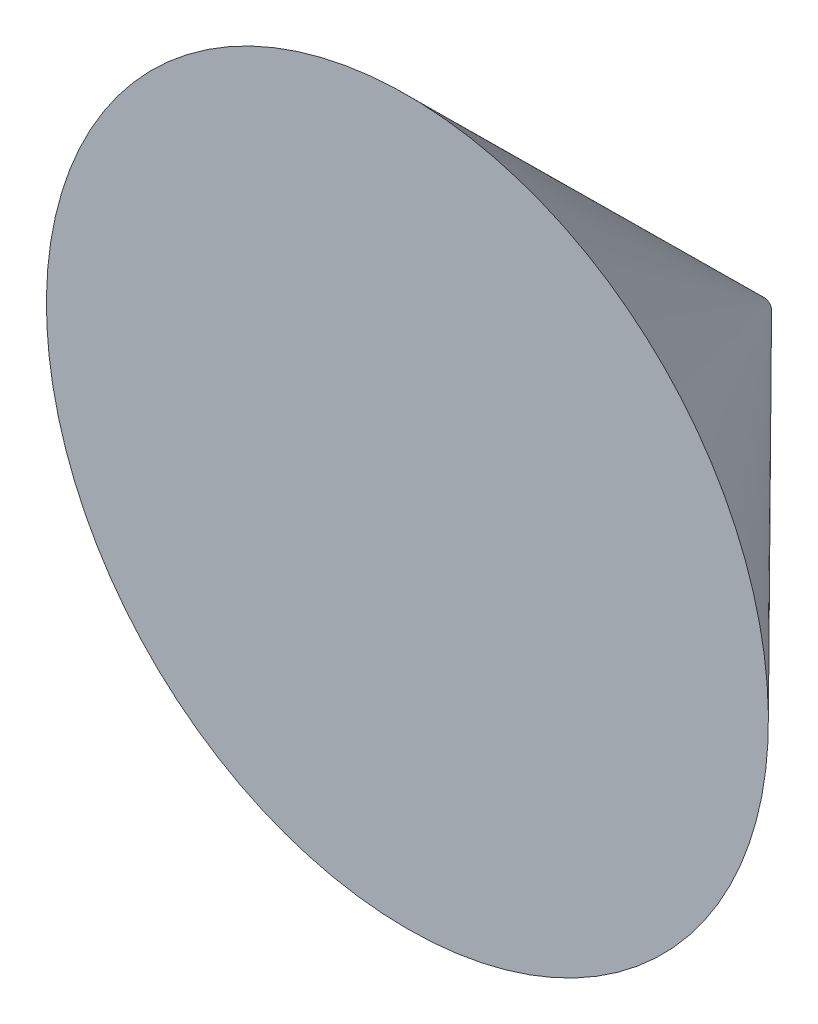
ISO-10303-21;
HEADER;
FILE_DESCRIPTION(('STEP AP214'),'2;1');
FILE_NAME('part.step','',(''),(''),'','','');
FILE_SCHEMA(('AUTOMOTIVE_DESIGN { 1 0 10303 214 1 1 1 1 }'));
ENDSEC;
DATA;
#1=APPLICATION_CONTEXT('core data for automotive mechanical design processes');
#2=APPLICATION_PROTOCOL_DEFINITION('international standard','automotive_design',2000,#1);
#3=PRODUCT_CONTEXT('',#1,'mechanical');
#4=PRODUCT('Part','Part','',(#3));
#5=PRODUCT_RELATED_PRODUCT_CATEGORY('part','',(#4));
#6=PRODUCT_DEFINITION_FORMATION('','',#4);
#7=PRODUCT_DEFINITION_CONTEXT('part definition',#1,'design');
#8=PRODUCT_DEFINITION('design','',#6,#7);
#9=PRODUCT_DEFINITION_SHAPE('','',#8);
#10=(LENGTH_UNIT() NAMED_UNIT(*) SI_UNIT(.MILLI.,.METRE.));
#11=(NAMED_UNIT(*) PLANE_ANGLE_UNIT() SI_UNIT($,.RADIAN.));
#12=(NAMED_UNIT(*) SI_UNIT($,.STERADIAN.) SOLID_ANGLE_UNIT());
#13=UNCERTAINTY_MEASURE_WITH_UNIT(LENGTH_MEASURE(1.E-05),#10,'distance_accuracy_value','');
#14=(GEOMETRIC_REPRESENTATION_CONTEXT(3) GLOBAL_UNCERTAINTY_ASSIGNED_CONTEXT((#13)) GLOBAL_UNIT_ASSIGNED_CONTEXT((#10,
#11,#12)) REPRESENTATION_CONTEXT('',''));
#15=CARTESIAN_POINT('',(0.,0.,0.));
#16=DIRECTION('',(0.,0.,1.));
#17=DIRECTION('',(1.,0.,0.));
#18=AXIS2_PLACEMENT_3D('',#15,#16,#17);
#19=CARTESIAN_POINT('',(0.,4.,0.));
#20=DIRECTION('',(0.,0.,-1.));
#21=DIRECTION('',(0.,1.,0.));
#22=AXIS2_PLACEMENT_3D('',#19,#20,#21);
#23=PLANE('',#22);
#24=CARTESIAN_POINT('',(0.,0.,0.));
#25=DIRECTION('',(0.,0.,-1.));
#26=DIRECTION('',(0.,1.,0.));
#27=AXIS2_PLACEMENT_3D('',#24,#25,#26);
#28=CIRCLE('',#27,4.);
#29=CARTESIAN_POINT('',(0.,-4.,0.));
#30=VERTEX_POINT('',#29);
#31=EDGE_CURVE('E44',#30,#30,#28,.T.);
#32=ORIENTED_EDGE('',*,*,#31,.T.);
#33=EDGE_LOOP('',(#32));
#34=FACE_BOUND('',#33,.T.);
#35=ADVANCED_FACE('F37',(#34),#23,.T.);
#36=CARTESIAN_POINT('',(0.,0.,196.));
#37=DIRECTION('',(0.,0.,1.));
#38=DIRECTION('',(0.,-1.,0.));
#39=AXIS2_PLACEMENT_3D('',#36,#37,#38);
#40=PLANE('',#39);
#41=CARTESIAN_POINT('',(0.,0.,196.));
#42=DIRECTION('',(0.,0.,-1.));
#43=DIRECTION('',(0.,1.,0.));
#44=AXIS2_PLACEMENT_3D('',#41,#42,#43);
#45=CIRCLE('',#44,198.296997276613);
#46=CARTESIAN_POINT('',(0.,-198.296997276614,196.));
#47=VERTEX_POINT('',#46);
#48=EDGE_CURVE('E10',#47,#47,#45,.T.);
#49=ORIENTED_EDGE('',*,*,#48,.F.);
#50=EDGE_LOOP('',(#49));
#51=FACE_BOUND('',#50,.T.);
#52=ADVANCED_FACE('F54',(#51),#40,.T.);
#53=CARTESIAN_POINT('',(0.,0.,0.));
#54=DIRECTION('',(0.,0.,1.));
#55=DIRECTION('',(0.,-1.,0.));
#56=AXIS2_PLACEMENT_3D('',#53,#54,#55);
#57=CONICAL_SURFACE('',#56,4.,0.781034840267457);
#58=CARTESIAN_POINT('',(0.,-198.296997276614,196.));
#59=CARTESIAN_POINT('',(0.,-196.273070221649,193.958333333333));
#60=CARTESIAN_POINT('',(0.,-194.249143166684,191.916666666667));
#61=CARTESIAN_POINT('',(0.,-190.201289056755,187.833333333333));
#62=CARTESIAN_POINT('',(0.,-188.17736200179,185.791666666667));
#63=CARTESIAN_POINT('',(0.,-184.12950789186,181.708333333333));
#64=CARTESIAN_POINT('',(0.,-182.105580836896,179.666666666667));
#65=CARTESIAN_POINT('',(0.,-178.057726726966,175.583333333333));
#66=CARTESIAN_POINT('',(0.,-176.033799672002,173.541666666667));
#67=CARTESIAN_POINT('',(0.,-171.985945562072,169.458333333333));
#68=CARTESIAN_POINT('',(0.,-169.962018507107,167.416666666667));
#69=CARTESIAN_POINT('',(0.,-165.914164397178,163.333333333333));
#70=CARTESIAN_POINT('',(0.,-163.890237342213,161.291666666667));
#71=CARTESIAN_POINT('',(0.,-159.842383232284,157.208333333333));
#72=CARTESIAN_POINT('',(0.,-157.818456177319,155.166666666667));
#73=CARTESIAN_POINT('',(0.,-153.77060206739,151.083333333333));
#74=CARTESIAN_POINT('',(0.,-151.746675012425,149.041666666667));
#75=CARTESIAN_POINT('',(0.,-147.698820902495,144.958333333333));
#76=CARTESIAN_POINT('',(0.,-145.674893847531,142.916666666667));
#77=CARTESIAN_POINT('',(0.,-141.627039737601,138.833333333333));
#78=CARTESIAN_POINT('',(0.,-139.603112682637,136.791666666667));
#79=CARTESIAN_POINT('',(0.,-135.555258572707,132.708333333333));
#80=CARTESIAN_POINT('',(0.,-133.531331517742,130.666666666667));
#81=CARTESIAN_POINT('',(0.,-129.483477407813,126.583333333333));
#82=CARTESIAN_POINT('',(0.,-127.459550352848,124.541666666667));
#83=CARTESIAN_POINT('',(0.,-123.411696242919,120.458333333333));
#84=CARTESIAN_POINT('',(0.,-121.387769187954,118.416666666667));
#85=CARTESIAN_POINT('',(0.,-117.339915078025,114.333333333333));
#86=CARTESIAN_POINT('',(0.,-115.31598802306,112.291666666667));
#87=CARTESIAN_POINT('',(0.,-111.26813391313,108.208333333333));
#88=CARTESIAN_POINT('',(0.,-109.244206858166,106.166666666667));
#89=CARTESIAN_POINT('',(0.,-105.196352748236,102.083333333333));
#90=CARTESIAN_POINT('',(0.,-103.172425693271,100.041666666667));
#91=CARTESIAN_POINT('',(0.,-99.124571583342,95.9583333333333));
#92=CARTESIAN_POINT('',(0.,-97.1006445283773,93.9166666666666));
#93=CARTESIAN_POINT('',(0.,-93.0527904184479,89.8333333333333));
#94=CARTESIAN_POINT('',(0.,-91.0288633634832,87.7916666666667));
#95=CARTESIAN_POINT('',(0.,-86.9810092535537,83.7083333333333));
#96=CARTESIAN_POINT('',(0.,-84.957082198589,81.6666666666667));
#97=CARTESIAN_POINT('',(0.,-80.9092280886595,77.5833333333333));
#98=CARTESIAN_POINT('',(0.,-78.8853010336948,75.5416666666667));
#99=CARTESIAN_POINT('',(0.,-74.8374469237653,71.4583333333333));
#100=CARTESIAN_POINT('',(0.,-72.8135198688006,69.4166666666667));
#101=CARTESIAN_POINT('',(0.,-68.7656657588712,65.3333333333333));
#102=CARTESIAN_POINT('',(0.,-66.7417387039064,63.2916666666667));
#103=CARTESIAN_POINT('',(0.,-62.693884593977,59.2083333333333));
#104=CARTESIAN_POINT('',(0.,-60.6699575390123,57.1666666666667));
#105=CARTESIAN_POINT('',(0.,-56.6221034290828,53.0833333333333));
#106=CARTESIAN_POINT('',(0.,-54.5981763741181,51.0416666666667));
#107=CARTESIAN_POINT('',(0.,-50.5503222641886,46.9583333333333));
#108=CARTESIAN_POINT('',(0.,-48.5263952092239,44.9166666666667));
#109=CARTESIAN_POINT('',(0.,-44.4785410992945,40.8333333333333));
#110=CARTESIAN_POINT('',(0.,-42.4546140443298,38.7916666666667));
#111=CARTESIAN_POINT('',(0.,-38.4067599344003,34.7083333333333));
#112=CARTESIAN_POINT('',(0.,-36.3828328794356,32.6666666666667));
#113=CARTESIAN_POINT('',(0.,-32.3349787695061,28.5833333333333));
#114=CARTESIAN_POINT('',(0.,-30.3110517145414,26.5416666666667));
#115=CARTESIAN_POINT('',(0.,-26.263197604612,22.4583333333333));
#116=CARTESIAN_POINT('',(0.,-24.2392705496472,20.4166666666667));
#117=CARTESIAN_POINT('',(0.,-20.1914164397178,16.3333333333333));
#118=CARTESIAN_POINT('',(0.,-18.1674893847531,14.2916666666667));
#119=CARTESIAN_POINT('',(0.,-14.1196352748236,10.2083333333333));
#120=CARTESIAN_POINT('',(0.,-12.0957082198589,8.16666666666666));
#121=CARTESIAN_POINT('',(0.,-8.04785410992944,4.08333333333333));
#122=CARTESIAN_POINT('',(0.,-6.02392705496472,2.04166666666666));
#123=CARTESIAN_POINT('',(0.,-4.,0.));
#124=B_SPLINE_CURVE_WITH_KNOTS('',3,(#58,#59,#60,#61,#62,#63,#64,#65,#66,#67,#68,#69,#70,#71,
#72,#73,#74,#75,#76,#77,#78,#79,#80,#81,#82,#83,#84,#85,#86,#87,#88,#89,#90,#91,#92,#93,#94,#95,
#96,#97,#98,#99,#100,#101,#102,#103,#104,#105,#106,#107,#108,#109,#110,#111,#112,#113,#114,#115,
#116,#117,#118,#119,#120,#121,#122,#123),.UNSPECIFIED.,.F.,.F.,(4,2,2,2,2,2,2,2,2,2,2,2,2,2,2,2,
2,2,2,2,2,2,2,2,2,2,2,2,2,2,2,2,4),(0.,8.62450876945251,17.2490175389051,25.8735263083576,
34.4980350778101,43.1225438472627,51.7470526167152,60.3715613861677,68.9960701556202,
77.6205789250728,86.2450876945253,94.8695964639779,103.49410523343,112.118614002883,
120.743122772335,129.367631541788,137.99214031124,146.616649080693,155.241157850146,
163.865666619598,172.490175389051,181.114684158503,189.739192927956,198.363701697408,
206.988210466861,215.612719236313,224.237228005766,232.861736775218,241.486245544671,
250.110754314123,258.735263083576,267.359771853028,275.984280622481),.UNSPECIFIED.);
#125=EDGE_CURVE('BSEAM52',#47,#30,#124,.T.);
#126=ORIENTED_EDGE('',*,*,#48,.T.);
#127=ORIENTED_EDGE('',*,*,#31,.F.);
#128=ORIENTED_EDGE('',*,*,#125,.T.);
#129=ORIENTED_EDGE('',*,*,#125,.F.);
#130=EDGE_LOOP('',(#126,#128,#127,#129));
#131=FACE_BOUND('',#130,.T.);
#132=ADVANCED_FACE('F52',(#131),#57,.T.);
#133=CLOSED_SHELL('',(#35,#52,#132));
#134=MANIFOLD_SOLID_BREP('B2',#133);
#135=ADVANCED_BREP_SHAPE_REPRESENTATION('',(#18,#134),#14);
#136=SHAPE_DEFINITION_REPRESENTATION(#9,#135);
ENDSEC;
END-ISO-10303-21;
